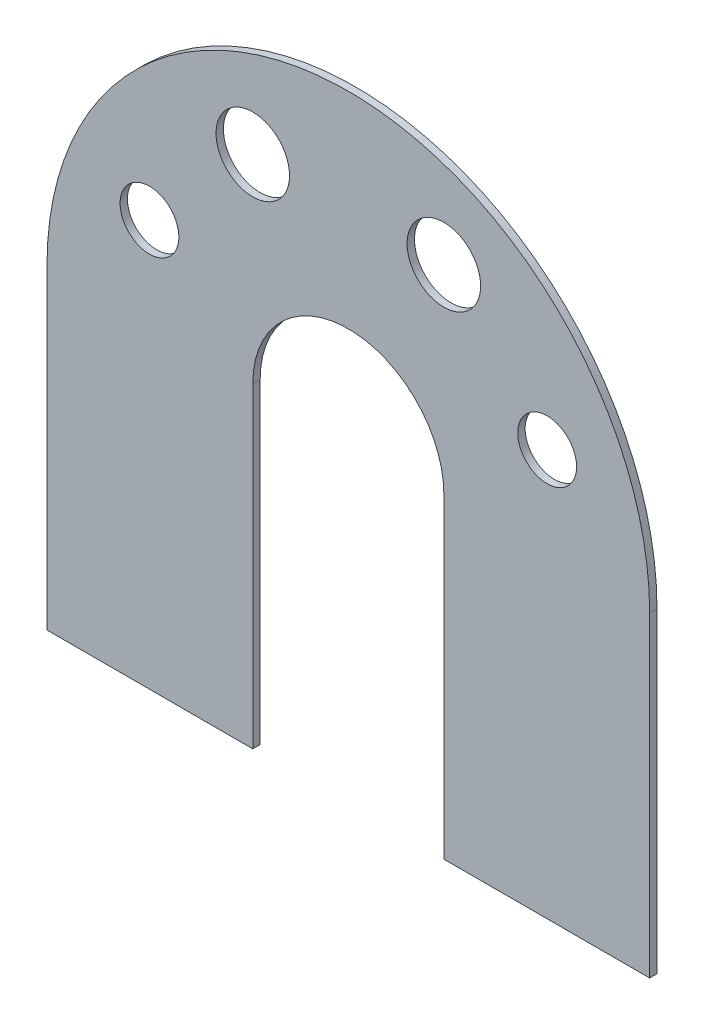
ISO-10303-21;
HEADER;
FILE_DESCRIPTION(('STEP AP214'),'2;1');
FILE_NAME('part.step','',(''),(''),'','','');
FILE_SCHEMA(('AUTOMOTIVE_DESIGN { 1 0 10303 214 1 1 1 1 }'));
ENDSEC;
DATA;
#1=APPLICATION_CONTEXT('core data for automotive mechanical design processes');
#2=APPLICATION_PROTOCOL_DEFINITION('international standard','automotive_design',2000,#1);
#3=PRODUCT_CONTEXT('',#1,'mechanical');
#4=PRODUCT('Part','Part','',(#3));
#5=PRODUCT_RELATED_PRODUCT_CATEGORY('part','',(#4));
#6=PRODUCT_DEFINITION_FORMATION('','',#4);
#7=PRODUCT_DEFINITION_CONTEXT('part definition',#1,'design');
#8=PRODUCT_DEFINITION('design','',#6,#7);
#9=PRODUCT_DEFINITION_SHAPE('','',#8);
#10=(LENGTH_UNIT() NAMED_UNIT(*) SI_UNIT(.MILLI.,.METRE.));
#11=(NAMED_UNIT(*) PLANE_ANGLE_UNIT() SI_UNIT($,.RADIAN.));
#12=(NAMED_UNIT(*) SI_UNIT($,.STERADIAN.) SOLID_ANGLE_UNIT());
#13=UNCERTAINTY_MEASURE_WITH_UNIT(LENGTH_MEASURE(1.E-05),#10,'distance_accuracy_value','');
#14=(GEOMETRIC_REPRESENTATION_CONTEXT(3) GLOBAL_UNCERTAINTY_ASSIGNED_CONTEXT((#13)) GLOBAL_UNIT_ASSIGNED_CONTEXT((#10,
#11,#12)) REPRESENTATION_CONTEXT('',''));
#15=CARTESIAN_POINT('',(0.,0.,0.));
#16=DIRECTION('',(0.,0.,1.));
#17=DIRECTION('',(1.,0.,0.));
#18=AXIS2_PLACEMENT_3D('',#15,#16,#17);
#19=CARTESIAN_POINT('',(-410.,-430.,10.));
#20=DIRECTION('',(0.,1.,0.));
#21=DIRECTION('',(0.,0.,1.));
#22=AXIS2_PLACEMENT_3D('',#19,#20,#21);
#23=PLANE('',#22);
#24=DIRECTION('',(1.,0.,0.));
#25=VECTOR('',#24,1.);
#26=CARTESIAN_POINT('',(-410.,-430.,10.));
#27=LINE('',#26,#25);
#28=CARTESIAN_POINT('',(130.,-430.,10.));
#29=VERTEX_POINT('',#28);
#30=CARTESIAN_POINT('',(410.,-430.,10.));
#31=VERTEX_POINT('',#30);
#32=EDGE_CURVE('E155',#29,#31,#27,.T.);
#33=ORIENTED_EDGE('',*,*,#32,.F.);
#34=DIRECTION('',(0.,0.,1.));
#35=VECTOR('',#34,1.);
#36=CARTESIAN_POINT('',(130.,-430.,-40.));
#37=LINE('',#36,#35);
#38=CARTESIAN_POINT('',(130.,-430.,0.));
#39=VERTEX_POINT('',#38);
#40=EDGE_CURVE('E137',#39,#29,#37,.T.);
#41=ORIENTED_EDGE('',*,*,#40,.F.);
#42=DIRECTION('',(1.,0.,0.));
#43=VECTOR('',#42,1.);
#44=CARTESIAN_POINT('',(-410.,-430.,0.));
#45=LINE('',#44,#43);
#46=CARTESIAN_POINT('',(410.,-430.,0.));
#47=VERTEX_POINT('',#46);
#48=EDGE_CURVE('E164',#39,#47,#45,.T.);
#49=ORIENTED_EDGE('',*,*,#48,.T.);
#50=DIRECTION('',(0.,0.,-1.));
#51=VECTOR('',#50,1.);
#52=CARTESIAN_POINT('',(410.,-430.,10.));
#53=LINE('',#52,#51);
#54=EDGE_CURVE('E170',#31,#47,#53,.T.);
#55=ORIENTED_EDGE('',*,*,#54,.F.);
#56=EDGE_LOOP('',(#33,#41,#49,#55));
#57=FACE_BOUND('',#56,.T.);
#58=ADVANCED_FACE('F35',(#57),#23,.F.);
#59=CARTESIAN_POINT('',(0.,0.,10.));
#60=DIRECTION('',(0.,0.,-1.));
#61=DIRECTION('',(-1.,0.,0.));
#62=AXIS2_PLACEMENT_3D('',#59,#60,#61);
#63=CYLINDRICAL_SURFACE('',#62,410.);
#64=CARTESIAN_POINT('',(0.,0.,0.));
#65=DIRECTION('',(0.,0.,1.));
#66=DIRECTION('',(1.,0.,0.));
#67=AXIS2_PLACEMENT_3D('',#64,#65,#66);
#68=CIRCLE('',#67,410.);
#69=CARTESIAN_POINT('',(410.,0.,0.));
#70=VERTEX_POINT('',#69);
#71=CARTESIAN_POINT('',(-410.,0.,0.));
#72=VERTEX_POINT('',#71);
#73=EDGE_CURVE('E159',#70,#72,#68,.T.);
#74=ORIENTED_EDGE('',*,*,#73,.T.);
#75=DIRECTION('',(0.,0.,-1.));
#76=VECTOR('',#75,1.);
#77=CARTESIAN_POINT('',(-410.,0.,10.));
#78=LINE('',#77,#76);
#79=CARTESIAN_POINT('',(-410.,0.,10.));
#80=VERTEX_POINT('',#79);
#81=EDGE_CURVE('E175',#80,#72,#78,.T.);
#82=ORIENTED_EDGE('',*,*,#81,.F.);
#83=CARTESIAN_POINT('',(0.,0.,10.));
#84=DIRECTION('',(0.,0.,1.));
#85=DIRECTION('',(1.,0.,0.));
#86=AXIS2_PLACEMENT_3D('',#83,#84,#85);
#87=CIRCLE('',#86,410.);
#88=CARTESIAN_POINT('',(410.,0.,10.));
#89=VERTEX_POINT('',#88);
#90=EDGE_CURVE('E152',#89,#80,#87,.T.);
#91=ORIENTED_EDGE('',*,*,#90,.F.);
#92=DIRECTION('',(0.,0.,-1.));
#93=VECTOR('',#92,1.);
#94=CARTESIAN_POINT('',(410.,0.,10.));
#95=LINE('',#94,#93);
#96=EDGE_CURVE('E158',#89,#70,#95,.T.);
#97=ORIENTED_EDGE('',*,*,#96,.T.);
#98=EDGE_LOOP('',(#74,#82,#91,#97));
#99=FACE_BOUND('',#98,.T.);
#100=ADVANCED_FACE('F37',(#99),#63,.T.);
#101=CARTESIAN_POINT('',(-410.,0.,10.));
#102=DIRECTION('',(1.,0.,0.));
#103=DIRECTION('',(0.,1.,0.));
#104=AXIS2_PLACEMENT_3D('',#101,#102,#103);
#105=PLANE('',#104);
#106=DIRECTION('',(0.,-1.,0.));
#107=VECTOR('',#106,1.);
#108=CARTESIAN_POINT('',(-410.,0.,0.));
#109=LINE('',#108,#107);
#110=CARTESIAN_POINT('',(-410.,-430.,0.));
#111=VERTEX_POINT('',#110);
#112=EDGE_CURVE('E162',#72,#111,#109,.T.);
#113=ORIENTED_EDGE('',*,*,#112,.T.);
#114=DIRECTION('',(0.,0.,-1.));
#115=VECTOR('',#114,1.);
#116=CARTESIAN_POINT('',(-410.,-430.,10.));
#117=LINE('',#116,#115);
#118=CARTESIAN_POINT('',(-410.,-430.,10.));
#119=VERTEX_POINT('',#118);
#120=EDGE_CURVE('E172',#119,#111,#117,.T.);
#121=ORIENTED_EDGE('',*,*,#120,.F.);
#122=DIRECTION('',(0.,-1.,0.));
#123=VECTOR('',#122,1.);
#124=CARTESIAN_POINT('',(-410.,0.,10.));
#125=LINE('',#124,#123);
#126=EDGE_CURVE('E88',#80,#119,#125,.T.);
#127=ORIENTED_EDGE('',*,*,#126,.F.);
#128=ORIENTED_EDGE('',*,*,#81,.T.);
#129=EDGE_LOOP('',(#113,#121,#127,#128));
#130=FACE_BOUND('',#129,.T.);
#131=ADVANCED_FACE('F201',(#130),#105,.F.);
#132=CARTESIAN_POINT('',(-130.,-430.,0.));
#133=VERTEX_POINT('',#132);
#134=EDGE_CURVE('E165',#111,#133,#45,.T.);
#135=ORIENTED_EDGE('',*,*,#134,.T.);
#136=DIRECTION('',(0.,0.,1.));
#137=VECTOR('',#136,1.);
#138=CARTESIAN_POINT('',(-130.,-430.,-40.));
#139=LINE('',#138,#137);
#140=CARTESIAN_POINT('',(-130.,-430.,10.));
#141=VERTEX_POINT('',#140);
#142=EDGE_CURVE('E50',#133,#141,#139,.T.);
#143=ORIENTED_EDGE('',*,*,#142,.T.);
#144=EDGE_CURVE('E130',#119,#141,#27,.T.);
#145=ORIENTED_EDGE('',*,*,#144,.F.);
#146=ORIENTED_EDGE('',*,*,#120,.T.);
#147=EDGE_LOOP('',(#135,#143,#145,#146));
#148=FACE_BOUND('',#147,.T.);
#149=ADVANCED_FACE('F203',(#148),#23,.F.);
#150=CARTESIAN_POINT('',(410.,-430.,10.));
#151=DIRECTION('',(-1.,0.,0.));
#152=DIRECTION('',(0.,-1.,0.));
#153=AXIS2_PLACEMENT_3D('',#150,#151,#152);
#154=PLANE('',#153);
#155=DIRECTION('',(0.,1.,0.));
#156=VECTOR('',#155,1.);
#157=CARTESIAN_POINT('',(410.,-430.,0.));
#158=LINE('',#157,#156);
#159=EDGE_CURVE('E80',#47,#70,#158,.T.);
#160=ORIENTED_EDGE('',*,*,#159,.T.);
#161=ORIENTED_EDGE('',*,*,#96,.F.);
#162=DIRECTION('',(0.,1.,0.));
#163=VECTOR('',#162,1.);
#164=CARTESIAN_POINT('',(410.,-430.,10.));
#165=LINE('',#164,#163);
#166=EDGE_CURVE('E59',#31,#89,#165,.T.);
#167=ORIENTED_EDGE('',*,*,#166,.F.);
#168=ORIENTED_EDGE('',*,*,#54,.T.);
#169=EDGE_LOOP('',(#160,#161,#167,#168));
#170=FACE_BOUND('',#169,.T.);
#171=ADVANCED_FACE('F196',(#170),#154,.F.);
#172=CARTESIAN_POINT('',(0.,0.,10.));
#173=DIRECTION('',(0.,0.,1.));
#174=DIRECTION('',(1.,0.,0.));
#175=AXIS2_PLACEMENT_3D('',#172,#173,#174);
#176=PLANE('',#175);
#177=DIRECTION('',(0.,1.,0.));
#178=VECTOR('',#177,1.);
#179=CARTESIAN_POINT('',(130.,-430.,10.));
#180=LINE('',#179,#178);
#181=CARTESIAN_POINT('',(130.,0.,10.));
#182=VERTEX_POINT('',#181);
#183=EDGE_CURVE('E116',#29,#182,#180,.T.);
#184=ORIENTED_EDGE('',*,*,#183,.F.);
#185=ORIENTED_EDGE('',*,*,#32,.T.);
#186=ORIENTED_EDGE('',*,*,#166,.T.);
#187=ORIENTED_EDGE('',*,*,#90,.T.);
#188=ORIENTED_EDGE('',*,*,#126,.T.);
#189=ORIENTED_EDGE('',*,*,#144,.T.);
#190=DIRECTION('',(0.,-1.,0.));
#191=VECTOR('',#190,1.);
#192=CARTESIAN_POINT('',(-130.,0.,10.));
#193=LINE('',#192,#191);
#194=CARTESIAN_POINT('',(-130.,0.,10.));
#195=VERTEX_POINT('',#194);
#196=EDGE_CURVE('E112',#195,#141,#193,.T.);
#197=ORIENTED_EDGE('',*,*,#196,.F.);
#198=CARTESIAN_POINT('',(0.,0.,10.));
#199=DIRECTION('',(0.,0.,1.));
#200=DIRECTION('',(1.,0.,0.));
#201=AXIS2_PLACEMENT_3D('',#198,#199,#200);
#202=CIRCLE('',#201,130.);
#203=EDGE_CURVE('E119',#182,#195,#202,.T.);
#204=ORIENTED_EDGE('',*,*,#203,.F.);
#205=EDGE_LOOP('',(#184,#185,#186,#187,#188,#189,#197,#204));
#206=FACE_BOUND('',#205,.T.);
#207=CARTESIAN_POINT('',(270.562773314808,122.701734359989,10.));
#208=DIRECTION('',(0.,0.,1.));
#209=DIRECTION('',(1.,0.,0.));
#210=AXIS2_PLACEMENT_3D('',#207,#208,#209);
#211=CIRCLE('',#210,40.);
#212=CARTESIAN_POINT('',(310.562773314808,122.701734359989,10.));
#213=VERTEX_POINT('',#212);
#214=EDGE_CURVE('E136',#213,#213,#211,.T.);
#215=ORIENTED_EDGE('',*,*,#214,.F.);
#216=EDGE_LOOP('',(#215));
#217=FACE_BOUND('',#216,.T.);
#218=CARTESIAN_POINT('',(-270.562773314808,122.701734359989,10.));
#219=DIRECTION('',(0.,0.,1.));
#220=DIRECTION('',(1.,0.,0.));
#221=AXIS2_PLACEMENT_3D('',#218,#219,#220);
#222=CIRCLE('',#221,40.);
#223=CARTESIAN_POINT('',(-230.562773314808,122.701734359989,10.));
#224=VERTEX_POINT('',#223);
#225=EDGE_CURVE('E144',#224,#224,#222,.T.);
#226=ORIENTED_EDGE('',*,*,#225,.F.);
#227=EDGE_LOOP('',(#226));
#228=FACE_BOUND('',#227,.T.);
#229=CARTESIAN_POINT('',(130.,270.438352593622,10.));
#230=DIRECTION('',(0.,0.,1.));
#231=DIRECTION('',(1.,0.,0.));
#232=AXIS2_PLACEMENT_3D('',#229,#230,#231);
#233=CIRCLE('',#232,50.);
#234=CARTESIAN_POINT('',(180.,270.438352593622,10.));
#235=VERTEX_POINT('',#234);
#236=EDGE_CURVE('E140',#235,#235,#233,.T.);
#237=ORIENTED_EDGE('',*,*,#236,.F.);
#238=EDGE_LOOP('',(#237));
#239=FACE_BOUND('',#238,.T.);
#240=CARTESIAN_POINT('',(-130.,270.438352593622,10.));
#241=DIRECTION('',(0.,0.,1.));
#242=DIRECTION('',(1.,0.,0.));
#243=AXIS2_PLACEMENT_3D('',#240,#241,#242);
#244=CIRCLE('',#243,50.);
#245=CARTESIAN_POINT('',(-80.0000000000001,270.438352593622,10.));
#246=VERTEX_POINT('',#245);
#247=EDGE_CURVE('E147',#246,#246,#244,.T.);
#248=ORIENTED_EDGE('',*,*,#247,.F.);
#249=EDGE_LOOP('',(#248));
#250=FACE_BOUND('',#249,.T.);
#251=ADVANCED_FACE('F127',(#206,#217,#228,#239,#250),#176,.T.);
#252=CARTESIAN_POINT('',(0.,0.,0.));
#253=DIRECTION('',(0.,0.,1.));
#254=DIRECTION('',(1.,0.,0.));
#255=AXIS2_PLACEMENT_3D('',#252,#253,#254);
#256=PLANE('',#255);
#257=CARTESIAN_POINT('',(270.562773314808,122.701734359989,0.));
#258=DIRECTION('',(0.,0.,1.));
#259=DIRECTION('',(1.,0.,0.));
#260=AXIS2_PLACEMENT_3D('',#257,#258,#259);
#261=CIRCLE('',#260,40.);
#262=CARTESIAN_POINT('',(310.562773314808,122.701734359989,0.));
#263=VERTEX_POINT('',#262);
#264=EDGE_CURVE('E151',#263,#263,#261,.T.);
#265=ORIENTED_EDGE('',*,*,#264,.T.);
#266=EDGE_LOOP('',(#265));
#267=FACE_BOUND('',#266,.T.);
#268=CARTESIAN_POINT('',(-270.562773314808,122.701734359989,0.));
#269=DIRECTION('',(0.,0.,1.));
#270=DIRECTION('',(1.,0.,0.));
#271=AXIS2_PLACEMENT_3D('',#268,#269,#270);
#272=CIRCLE('',#271,40.);
#273=CARTESIAN_POINT('',(-230.562773314808,122.701734359989,0.));
#274=VERTEX_POINT('',#273);
#275=EDGE_CURVE('E181',#274,#274,#272,.T.);
#276=ORIENTED_EDGE('',*,*,#275,.T.);
#277=EDGE_LOOP('',(#276));
#278=FACE_BOUND('',#277,.T.);
#279=CARTESIAN_POINT('',(130.,270.438352593622,0.));
#280=DIRECTION('',(0.,0.,1.));
#281=DIRECTION('',(1.,0.,0.));
#282=AXIS2_PLACEMENT_3D('',#279,#280,#281);
#283=CIRCLE('',#282,50.);
#284=CARTESIAN_POINT('',(180.,270.438352593622,0.));
#285=VERTEX_POINT('',#284);
#286=EDGE_CURVE('E143',#285,#285,#283,.T.);
#287=ORIENTED_EDGE('',*,*,#286,.T.);
#288=EDGE_LOOP('',(#287));
#289=FACE_BOUND('',#288,.T.);
#290=CARTESIAN_POINT('',(-130.,270.438352593622,0.));
#291=DIRECTION('',(0.,0.,1.));
#292=DIRECTION('',(1.,0.,0.));
#293=AXIS2_PLACEMENT_3D('',#290,#291,#292);
#294=CIRCLE('',#293,50.);
#295=CARTESIAN_POINT('',(-80.0000000000001,270.438352593622,0.));
#296=VERTEX_POINT('',#295);
#297=EDGE_CURVE('E150',#296,#296,#294,.T.);
#298=ORIENTED_EDGE('',*,*,#297,.T.);
#299=EDGE_LOOP('',(#298));
#300=FACE_BOUND('',#299,.T.);
#301=ORIENTED_EDGE('',*,*,#48,.F.);
#302=DIRECTION('',(0.,1.,0.));
#303=VECTOR('',#302,1.);
#304=CARTESIAN_POINT('',(130.,0.,0.));
#305=LINE('',#304,#303);
#306=CARTESIAN_POINT('',(130.,0.,0.));
#307=VERTEX_POINT('',#306);
#308=EDGE_CURVE('E11',#39,#307,#305,.T.);
#309=ORIENTED_EDGE('',*,*,#308,.T.);
#310=CARTESIAN_POINT('',(0.,0.,0.));
#311=DIRECTION('',(0.,0.,1.));
#312=DIRECTION('',(1.,0.,0.));
#313=AXIS2_PLACEMENT_3D('',#310,#311,#312);
#314=CIRCLE('',#313,130.);
#315=CARTESIAN_POINT('',(-130.,0.,0.));
#316=VERTEX_POINT('',#315);
#317=EDGE_CURVE('E43',#307,#316,#314,.T.);
#318=ORIENTED_EDGE('',*,*,#317,.T.);
#319=DIRECTION('',(0.,-1.,0.));
#320=VECTOR('',#319,1.);
#321=CARTESIAN_POINT('',(-130.,0.,0.));
#322=LINE('',#321,#320);
#323=EDGE_CURVE('E113',#316,#133,#322,.T.);
#324=ORIENTED_EDGE('',*,*,#323,.T.);
#325=ORIENTED_EDGE('',*,*,#134,.F.);
#326=ORIENTED_EDGE('',*,*,#112,.F.);
#327=ORIENTED_EDGE('',*,*,#73,.F.);
#328=ORIENTED_EDGE('',*,*,#159,.F.);
#329=EDGE_LOOP('',(#301,#309,#318,#324,#325,#326,#327,#328));
#330=FACE_BOUND('',#329,.T.);
#331=ADVANCED_FACE('F188',(#267,#278,#289,#300,#330),#256,.F.);
#332=CARTESIAN_POINT('',(-130.,270.438352593622,-40.));
#333=DIRECTION('',(0.,0.,1.));
#334=DIRECTION('',(1.,0.,0.));
#335=AXIS2_PLACEMENT_3D('',#332,#333,#334);
#336=CYLINDRICAL_SURFACE('',#335,50.);
#337=ORIENTED_EDGE('',*,*,#247,.T.);
#338=EDGE_LOOP('',(#337));
#339=FACE_BOUND('',#338,.T.);
#340=ORIENTED_EDGE('',*,*,#297,.F.);
#341=EDGE_LOOP('',(#340));
#342=FACE_BOUND('',#341,.T.);
#343=ADVANCED_FACE('F253',(#339,#342),#336,.F.);
#344=CARTESIAN_POINT('',(130.,270.438352593622,-40.));
#345=DIRECTION('',(0.,0.,1.));
#346=DIRECTION('',(1.,0.,0.));
#347=AXIS2_PLACEMENT_3D('',#344,#345,#346);
#348=CYLINDRICAL_SURFACE('',#347,50.);
#349=ORIENTED_EDGE('',*,*,#236,.T.);
#350=EDGE_LOOP('',(#349));
#351=FACE_BOUND('',#350,.T.);
#352=ORIENTED_EDGE('',*,*,#286,.F.);
#353=EDGE_LOOP('',(#352));
#354=FACE_BOUND('',#353,.T.);
#355=ADVANCED_FACE('F262',(#351,#354),#348,.F.);
#356=CARTESIAN_POINT('',(-270.562773314808,122.701734359989,-40.));
#357=DIRECTION('',(0.,0.,1.));
#358=DIRECTION('',(1.,0.,0.));
#359=AXIS2_PLACEMENT_3D('',#356,#357,#358);
#360=CYLINDRICAL_SURFACE('',#359,40.);
#361=ORIENTED_EDGE('',*,*,#225,.T.);
#362=EDGE_LOOP('',(#361));
#363=FACE_BOUND('',#362,.T.);
#364=ORIENTED_EDGE('',*,*,#275,.F.);
#365=EDGE_LOOP('',(#364));
#366=FACE_BOUND('',#365,.T.);
#367=ADVANCED_FACE('F272',(#363,#366),#360,.F.);
#368=CARTESIAN_POINT('',(270.562773314808,122.701734359989,-40.));
#369=DIRECTION('',(0.,0.,1.));
#370=DIRECTION('',(1.,0.,0.));
#371=AXIS2_PLACEMENT_3D('',#368,#369,#370);
#372=CYLINDRICAL_SURFACE('',#371,40.);
#373=ORIENTED_EDGE('',*,*,#214,.T.);
#374=EDGE_LOOP('',(#373));
#375=FACE_BOUND('',#374,.T.);
#376=ORIENTED_EDGE('',*,*,#264,.F.);
#377=EDGE_LOOP('',(#376));
#378=FACE_BOUND('',#377,.T.);
#379=ADVANCED_FACE('F282',(#375,#378),#372,.F.);
#380=CARTESIAN_POINT('',(0.,0.,-40.));
#381=DIRECTION('',(0.,0.,1.));
#382=DIRECTION('',(1.,0.,0.));
#383=AXIS2_PLACEMENT_3D('',#380,#381,#382);
#384=CYLINDRICAL_SURFACE('',#383,130.);
#385=DIRECTION('',(0.,0.,1.));
#386=VECTOR('',#385,1.);
#387=CARTESIAN_POINT('',(130.,0.,-40.));
#388=LINE('',#387,#386);
#389=EDGE_CURVE('E122',#307,#182,#388,.T.);
#390=ORIENTED_EDGE('',*,*,#389,.T.);
#391=ORIENTED_EDGE('',*,*,#203,.T.);
#392=DIRECTION('',(0.,0.,1.));
#393=VECTOR('',#392,1.);
#394=CARTESIAN_POINT('',(-130.,0.,-40.));
#395=LINE('',#394,#393);
#396=EDGE_CURVE('E108',#316,#195,#395,.T.);
#397=ORIENTED_EDGE('',*,*,#396,.F.);
#398=ORIENTED_EDGE('',*,*,#317,.F.);
#399=EDGE_LOOP('',(#390,#391,#397,#398));
#400=FACE_BOUND('',#399,.T.);
#401=ADVANCED_FACE('F120',(#400),#384,.F.);
#402=CARTESIAN_POINT('',(130.,-430.,-40.));
#403=DIRECTION('',(1.,0.,0.));
#404=DIRECTION('',(0.,1.,0.));
#405=AXIS2_PLACEMENT_3D('',#402,#403,#404);
#406=PLANE('',#405);
#407=ORIENTED_EDGE('',*,*,#40,.T.);
#408=ORIENTED_EDGE('',*,*,#183,.T.);
#409=ORIENTED_EDGE('',*,*,#389,.F.);
#410=ORIENTED_EDGE('',*,*,#308,.F.);
#411=EDGE_LOOP('',(#407,#408,#409,#410));
#412=FACE_BOUND('',#411,.T.);
#413=ADVANCED_FACE('F191',(#412),#406,.F.);
#414=CARTESIAN_POINT('',(-130.,0.,-40.));
#415=DIRECTION('',(-1.,0.,0.));
#416=DIRECTION('',(0.,-1.,0.));
#417=AXIS2_PLACEMENT_3D('',#414,#415,#416);
#418=PLANE('',#417);
#419=ORIENTED_EDGE('',*,*,#396,.T.);
#420=ORIENTED_EDGE('',*,*,#196,.T.);
#421=ORIENTED_EDGE('',*,*,#142,.F.);
#422=ORIENTED_EDGE('',*,*,#323,.F.);
#423=EDGE_LOOP('',(#419,#420,#421,#422));
#424=FACE_BOUND('',#423,.T.);
#425=ADVANCED_FACE('F110',(#424),#418,.F.);
#426=CLOSED_SHELL('',(#58,#100,#131,#149,#171,#251,#331,#343,#355,#367,#379,#401,#413,#425));
#427=MANIFOLD_SOLID_BREP('B2',#426);
#428=ADVANCED_BREP_SHAPE_REPRESENTATION('',(#18,#427),#14);
#429=SHAPE_DEFINITION_REPRESENTATION(#9,#428);
ENDSEC;
END-ISO-10303-21;
